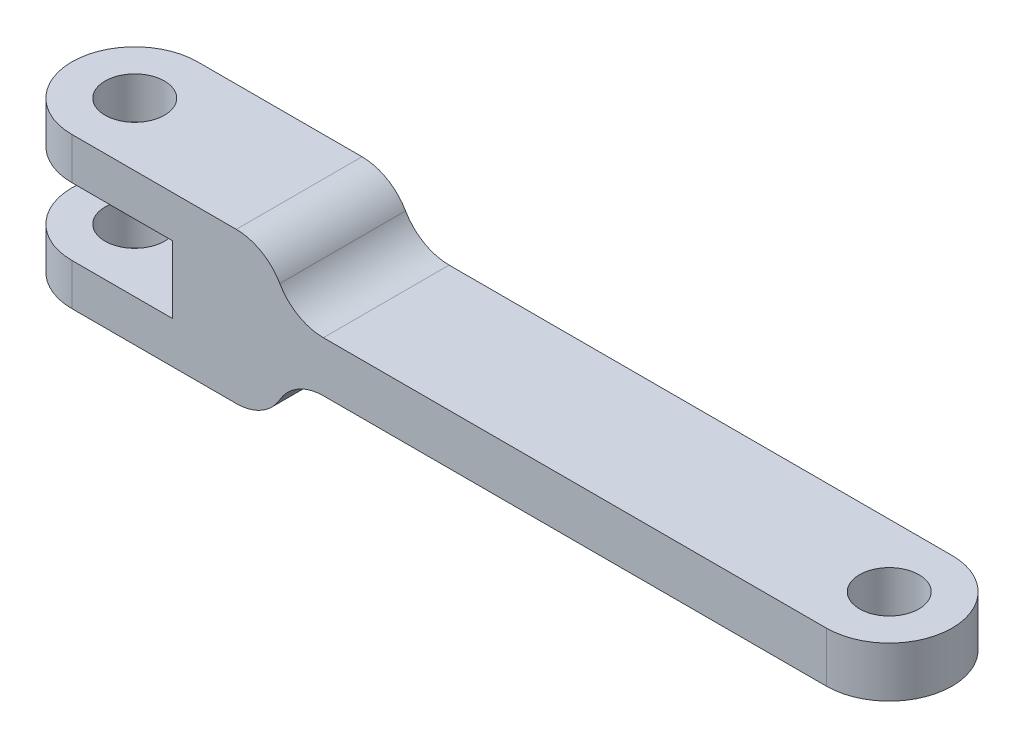
ISO-10303-21;
HEADER;
FILE_DESCRIPTION(('STEP AP214'),'2;1');
FILE_NAME('part.step','',(''),(''),'','','');
FILE_SCHEMA(('AUTOMOTIVE_DESIGN { 1 0 10303 214 1 1 1 1 }'));
ENDSEC;
DATA;
#1=APPLICATION_CONTEXT('core data for automotive mechanical design processes');
#2=APPLICATION_PROTOCOL_DEFINITION('international standard','automotive_design',2000,#1);
#3=PRODUCT_CONTEXT('',#1,'mechanical');
#4=PRODUCT('Part','Part','',(#3));
#5=PRODUCT_RELATED_PRODUCT_CATEGORY('part','',(#4));
#6=PRODUCT_DEFINITION_FORMATION('','',#4);
#7=PRODUCT_DEFINITION_CONTEXT('part definition',#1,'design');
#8=PRODUCT_DEFINITION('design','',#6,#7);
#9=PRODUCT_DEFINITION_SHAPE('','',#8);
#10=(LENGTH_UNIT() NAMED_UNIT(*) SI_UNIT(.MILLI.,.METRE.));
#11=(NAMED_UNIT(*) PLANE_ANGLE_UNIT() SI_UNIT($,.RADIAN.));
#12=(NAMED_UNIT(*) SI_UNIT($,.STERADIAN.) SOLID_ANGLE_UNIT());
#13=UNCERTAINTY_MEASURE_WITH_UNIT(LENGTH_MEASURE(1.E-05),#10,'distance_accuracy_value','');
#14=(GEOMETRIC_REPRESENTATION_CONTEXT(3) GLOBAL_UNCERTAINTY_ASSIGNED_CONTEXT((#13)) GLOBAL_UNIT_ASSIGNED_CONTEXT((#10,
#11,#12)) REPRESENTATION_CONTEXT('',''));
#15=CARTESIAN_POINT('',(0.,0.,0.));
#16=DIRECTION('',(0.,0.,1.));
#17=DIRECTION('',(1.,0.,0.));
#18=AXIS2_PLACEMENT_3D('',#15,#16,#17);
#19=CARTESIAN_POINT('',(38.1,7.62,0.));
#20=DIRECTION('',(0.,-1.,0.));
#21=DIRECTION('',(0.,0.,-1.));
#22=AXIS2_PLACEMENT_3D('',#19,#20,#21);
#23=CYLINDRICAL_SURFACE('',#22,3.17500000000001);
#24=DIRECTION('',(0.,-1.,0.));
#25=VECTOR('',#24,1.);
#26=CARTESIAN_POINT('',(38.1,7.62,3.175));
#27=LINE('',#26,#25);
#28=CARTESIAN_POINT('',(38.1,5.08,3.17500000000001));
#29=VERTEX_POINT('',#28);
#30=CARTESIAN_POINT('',(38.1,2.54,3.175));
#31=VERTEX_POINT('',#30);
#32=EDGE_CURVE('E181',#29,#31,#27,.T.);
#33=ORIENTED_EDGE('',*,*,#32,.T.);
#34=CARTESIAN_POINT('',(38.1,2.54,0.));
#35=DIRECTION('',(0.,-1.,0.));
#36=DIRECTION('',(0.,0.,-1.));
#37=AXIS2_PLACEMENT_3D('',#34,#35,#36);
#38=CIRCLE('',#37,3.17500000000001);
#39=CARTESIAN_POINT('',(38.1,2.54,-3.175));
#40=VERTEX_POINT('',#39);
#41=EDGE_CURVE('E168',#31,#40,#38,.F.);
#42=ORIENTED_EDGE('',*,*,#41,.T.);
#43=DIRECTION('',(0.,-1.,0.));
#44=VECTOR('',#43,1.);
#45=CARTESIAN_POINT('',(38.1,7.62,-3.175));
#46=LINE('',#45,#44);
#47=CARTESIAN_POINT('',(38.1,5.08,-3.175));
#48=VERTEX_POINT('',#47);
#49=EDGE_CURVE('E179',#48,#40,#46,.T.);
#50=ORIENTED_EDGE('',*,*,#49,.F.);
#51=CARTESIAN_POINT('',(38.1,5.08,0.));
#52=DIRECTION('',(0.,1.,0.));
#53=DIRECTION('',(0.,0.,1.));
#54=AXIS2_PLACEMENT_3D('',#51,#52,#53);
#55=CIRCLE('',#54,3.17500000000001);
#56=EDGE_CURVE('E206',#48,#29,#55,.F.);
#57=ORIENTED_EDGE('',*,*,#56,.T.);
#58=EDGE_LOOP('',(#33,#42,#50,#57));
#59=FACE_BOUND('',#58,.T.);
#60=ADVANCED_FACE('F60',(#59),#23,.T.);
#61=CARTESIAN_POINT('',(38.1,7.62,0.));
#62=DIRECTION('',(0.,-1.,0.));
#63=DIRECTION('',(0.,0.,-1.));
#64=AXIS2_PLACEMENT_3D('',#61,#62,#63);
#65=CYLINDRICAL_SURFACE('',#64,1.5);
#66=CARTESIAN_POINT('',(38.1,5.08,0.));
#67=DIRECTION('',(0.,1.,0.));
#68=DIRECTION('',(0.,0.,1.));
#69=AXIS2_PLACEMENT_3D('',#66,#67,#68);
#70=CIRCLE('',#69,1.5);
#71=CARTESIAN_POINT('',(38.1,5.08,-1.5));
#72=VERTEX_POINT('',#71);
#73=EDGE_CURVE('E202',#72,#72,#70,.F.);
#74=CARTESIAN_POINT('',(38.1,2.54,0.));
#75=DIRECTION('',(0.,-1.,0.));
#76=DIRECTION('',(0.,0.,-1.));
#77=AXIS2_PLACEMENT_3D('',#74,#75,#76);
#78=CIRCLE('',#77,1.5);
#79=CARTESIAN_POINT('',(38.1,2.54,-1.5));
#80=VERTEX_POINT('',#79);
#81=EDGE_CURVE('E183',#80,#80,#78,.F.);
#82=CARTESIAN_POINT('',(38.1,5.08,-1.5));
#83=CARTESIAN_POINT('',(38.1,5.05354166666667,-1.5));
#84=CARTESIAN_POINT('',(38.1,5.02708333333333,-1.5));
#85=CARTESIAN_POINT('',(38.1,4.97416666666667,-1.5));
#86=CARTESIAN_POINT('',(38.1,4.94770833333333,-1.5));
#87=CARTESIAN_POINT('',(38.1,4.89479166666667,-1.5));
#88=CARTESIAN_POINT('',(38.1,4.86833333333333,-1.5));
#89=CARTESIAN_POINT('',(38.1,4.81541666666667,-1.5));
#90=CARTESIAN_POINT('',(38.1,4.78895833333333,-1.5));
#91=CARTESIAN_POINT('',(38.1,4.73604166666667,-1.5));
#92=CARTESIAN_POINT('',(38.1,4.70958333333333,-1.5));
#93=CARTESIAN_POINT('',(38.1,4.65666666666667,-1.5));
#94=CARTESIAN_POINT('',(38.1,4.63020833333333,-1.5));
#95=CARTESIAN_POINT('',(38.1,4.57729166666667,-1.5));
#96=CARTESIAN_POINT('',(38.1,4.55083333333333,-1.5));
#97=CARTESIAN_POINT('',(38.1,4.49791666666667,-1.5));
#98=CARTESIAN_POINT('',(38.1,4.47145833333333,-1.5));
#99=CARTESIAN_POINT('',(38.1,4.41854166666667,-1.5));
#100=CARTESIAN_POINT('',(38.1,4.39208333333333,-1.5));
#101=CARTESIAN_POINT('',(38.1,4.33916666666667,-1.5));
#102=CARTESIAN_POINT('',(38.1,4.31270833333333,-1.5));
#103=CARTESIAN_POINT('',(38.1,4.25979166666667,-1.5));
#104=CARTESIAN_POINT('',(38.1,4.23333333333333,-1.5));
#105=CARTESIAN_POINT('',(38.1,4.18041666666667,-1.5));
#106=CARTESIAN_POINT('',(38.1,4.15395833333333,-1.5));
#107=CARTESIAN_POINT('',(38.1,4.10104166666667,-1.5));
#108=CARTESIAN_POINT('',(38.1,4.07458333333333,-1.5));
#109=CARTESIAN_POINT('',(38.1,4.02166666666667,-1.5));
#110=CARTESIAN_POINT('',(38.1,3.99520833333333,-1.5));
#111=CARTESIAN_POINT('',(38.1,3.94229166666667,-1.5));
#112=CARTESIAN_POINT('',(38.1,3.91583333333333,-1.5));
#113=CARTESIAN_POINT('',(38.1,3.86291666666667,-1.5));
#114=CARTESIAN_POINT('',(38.1,3.83645833333333,-1.5));
#115=CARTESIAN_POINT('',(38.1,3.78354166666667,-1.5));
#116=CARTESIAN_POINT('',(38.1,3.75708333333333,-1.5));
#117=CARTESIAN_POINT('',(38.1,3.70416666666667,-1.5));
#118=CARTESIAN_POINT('',(38.1,3.67770833333333,-1.5));
#119=CARTESIAN_POINT('',(38.1,3.62479166666667,-1.5));
#120=CARTESIAN_POINT('',(38.1,3.59833333333333,-1.5));
#121=CARTESIAN_POINT('',(38.1,3.54541666666667,-1.5));
#122=CARTESIAN_POINT('',(38.1,3.51895833333333,-1.5));
#123=CARTESIAN_POINT('',(38.1,3.46604166666667,-1.5));
#124=CARTESIAN_POINT('',(38.1,3.43958333333333,-1.5));
#125=CARTESIAN_POINT('',(38.1,3.38666666666667,-1.5));
#126=CARTESIAN_POINT('',(38.1,3.36020833333333,-1.5));
#127=CARTESIAN_POINT('',(38.1,3.30729166666667,-1.5));
#128=CARTESIAN_POINT('',(38.1,3.28083333333334,-1.5));
#129=CARTESIAN_POINT('',(38.1,3.22791666666667,-1.5));
#130=CARTESIAN_POINT('',(38.1,3.20145833333334,-1.5));
#131=CARTESIAN_POINT('',(38.1,3.14854166666667,-1.5));
#132=CARTESIAN_POINT('',(38.1,3.12208333333333,-1.5));
#133=CARTESIAN_POINT('',(38.1,3.06916666666667,-1.5));
#134=CARTESIAN_POINT('',(38.1,3.04270833333333,-1.5));
#135=CARTESIAN_POINT('',(38.1,2.98979166666667,-1.5));
#136=CARTESIAN_POINT('',(38.1,2.96333333333334,-1.5));
#137=CARTESIAN_POINT('',(38.1,2.91041666666667,-1.5));
#138=CARTESIAN_POINT('',(38.1,2.88395833333334,-1.5));
#139=CARTESIAN_POINT('',(38.1,2.83104166666667,-1.5));
#140=CARTESIAN_POINT('',(38.1,2.80458333333334,-1.5));
#141=CARTESIAN_POINT('',(38.1,2.75166666666667,-1.5));
#142=CARTESIAN_POINT('',(38.1,2.72520833333334,-1.5));
#143=CARTESIAN_POINT('',(38.1,2.67229166666667,-1.5));
#144=CARTESIAN_POINT('',(38.1,2.64583333333334,-1.5));
#145=CARTESIAN_POINT('',(38.1,2.59291666666667,-1.5));
#146=CARTESIAN_POINT('',(38.1,2.56645833333334,-1.5));
#147=CARTESIAN_POINT('',(38.1,2.54,-1.5));
#148=B_SPLINE_CURVE_WITH_KNOTS('',3,(#82,#83,#84,#85,#86,#87,#88,#89,#90,#91,#92,#93,#94,#95,
#96,#97,#98,#99,#100,#101,#102,#103,#104,#105,#106,#107,#108,#109,#110,#111,#112,#113,#114,#115,
#116,#117,#118,#119,#120,#121,#122,#123,#124,#125,#126,#127,#128,#129,#130,#131,#132,#133,#134,
#135,#136,#137,#138,#139,#140,#141,#142,#143,#144,#145,#146,#147),.UNSPECIFIED.,.F.,.F.,(4,2,2,
2,2,2,2,2,2,2,2,2,2,2,2,2,2,2,2,2,2,2,2,2,2,2,2,2,2,2,2,2,4),(0.,0.0793750000000004,
0.158750000000001,0.238125,0.3175,0.396875,0.476249999999999,0.555625,0.635,0.714375,
0.793749999999999,0.873124999999999,0.952499999999999,1.031875,1.11125,1.190625,1.27,1.349375,
1.42875,1.508125,1.5875,1.666875,1.74625,1.825625,1.905,1.984375,2.06375,2.143125,2.2225,
2.301875,2.38125,2.460625,2.54),.UNSPECIFIED.);
#149=EDGE_CURVE('BSEAM361',#72,#80,#148,.T.);
#150=ORIENTED_EDGE('',*,*,#73,.F.);
#151=ORIENTED_EDGE('',*,*,#81,.F.);
#152=ORIENTED_EDGE('',*,*,#149,.T.);
#153=ORIENTED_EDGE('',*,*,#149,.F.);
#154=EDGE_LOOP('',(#150,#152,#151,#153));
#155=FACE_BOUND('',#154,.T.);
#156=ADVANCED_FACE('F361',(#155),#65,.F.);
#157=CARTESIAN_POINT('',(0.,7.62,3.175));
#158=DIRECTION('',(0.,0.,1.));
#159=DIRECTION('',(1.,0.,0.));
#160=AXIS2_PLACEMENT_3D('',#157,#158,#159);
#161=PLANE('',#160);
#162=CARTESIAN_POINT('',(12.7,7.62,3.175));
#163=DIRECTION('',(0.,0.,1.));
#164=DIRECTION('',(1.,0.,0.));
#165=AXIS2_PLACEMENT_3D('',#162,#163,#164);
#166=CIRCLE('',#165,2.54);
#167=CARTESIAN_POINT('',(12.7,5.08,3.175));
#168=VERTEX_POINT('',#167);
#169=CARTESIAN_POINT('',(10.5002954743875,6.35,3.175));
#170=VERTEX_POINT('',#169);
#171=EDGE_CURVE('E212',#168,#170,#166,.F.);
#172=ORIENTED_EDGE('',*,*,#171,.T.);
#173=CARTESIAN_POINT('',(8.30059094877505,5.08,3.175));
#174=DIRECTION('',(0.,0.,1.));
#175=DIRECTION('',(1.,0.,0.));
#176=AXIS2_PLACEMENT_3D('',#173,#174,#175);
#177=CIRCLE('',#176,2.54);
#178=CARTESIAN_POINT('',(8.30059094877505,7.62,3.175));
#179=VERTEX_POINT('',#178);
#180=EDGE_CURVE('E232',#170,#179,#177,.T.);
#181=ORIENTED_EDGE('',*,*,#180,.T.);
#182=DIRECTION('',(-1.,0.,0.));
#183=VECTOR('',#182,1.);
#184=CARTESIAN_POINT('',(0.,7.62,3.175));
#185=LINE('',#184,#183);
#186=CARTESIAN_POINT('',(0.,7.62,3.175));
#187=VERTEX_POINT('',#186);
#188=EDGE_CURVE('E278',#179,#187,#185,.T.);
#189=ORIENTED_EDGE('',*,*,#188,.T.);
#190=DIRECTION('',(0.,-1.,0.));
#191=VECTOR('',#190,1.);
#192=CARTESIAN_POINT('',(0.,7.62,3.175));
#193=LINE('',#192,#191);
#194=CARTESIAN_POINT('',(0.,5.51,3.175));
#195=VERTEX_POINT('',#194);
#196=EDGE_CURVE('E279',#187,#195,#193,.T.);
#197=ORIENTED_EDGE('',*,*,#196,.T.);
#198=DIRECTION('',(1.,0.,0.));
#199=VECTOR('',#198,1.);
#200=CARTESIAN_POINT('',(5.08,5.51,3.175));
#201=LINE('',#200,#199);
#202=CARTESIAN_POINT('',(5.08,5.51,3.175));
#203=VERTEX_POINT('',#202);
#204=EDGE_CURVE('E312',#195,#203,#201,.T.);
#205=ORIENTED_EDGE('',*,*,#204,.T.);
#206=DIRECTION('',(0.,-1.,0.));
#207=VECTOR('',#206,1.);
#208=CARTESIAN_POINT('',(5.08,5.51,3.175));
#209=LINE('',#208,#207);
#210=CARTESIAN_POINT('',(5.08,2.11,3.175));
#211=VERTEX_POINT('',#210);
#212=EDGE_CURVE('E260',#203,#211,#209,.T.);
#213=ORIENTED_EDGE('',*,*,#212,.T.);
#214=DIRECTION('',(1.,0.,0.));
#215=VECTOR('',#214,1.);
#216=CARTESIAN_POINT('',(5.08,2.11,3.175));
#217=LINE('',#216,#215);
#218=CARTESIAN_POINT('',(0.,2.11,3.175));
#219=VERTEX_POINT('',#218);
#220=EDGE_CURVE('E330',#219,#211,#217,.T.);
#221=ORIENTED_EDGE('',*,*,#220,.F.);
#222=CARTESIAN_POINT('',(0.,0.,3.175));
#223=VERTEX_POINT('',#222);
#224=EDGE_CURVE('E257',#219,#223,#193,.T.);
#225=ORIENTED_EDGE('',*,*,#224,.T.);
#226=DIRECTION('',(-1.,0.,0.));
#227=VECTOR('',#226,1.);
#228=CARTESIAN_POINT('',(0.,0.,3.175));
#229=LINE('',#228,#227);
#230=CARTESIAN_POINT('',(8.30059094877505,0.,3.175));
#231=VERTEX_POINT('',#230);
#232=EDGE_CURVE('E249',#231,#223,#229,.T.);
#233=ORIENTED_EDGE('',*,*,#232,.F.);
#234=CARTESIAN_POINT('',(8.30059094877505,2.54,3.175));
#235=DIRECTION('',(0.,0.,1.));
#236=DIRECTION('',(1.,0.,0.));
#237=AXIS2_PLACEMENT_3D('',#234,#235,#236);
#238=CIRCLE('',#237,2.54);
#239=CARTESIAN_POINT('',(10.5002954743875,1.27,3.175));
#240=VERTEX_POINT('',#239);
#241=EDGE_CURVE('E229',#231,#240,#238,.T.);
#242=ORIENTED_EDGE('',*,*,#241,.T.);
#243=CARTESIAN_POINT('',(12.7,0.,3.175));
#244=DIRECTION('',(0.,0.,1.));
#245=DIRECTION('',(1.,0.,0.));
#246=AXIS2_PLACEMENT_3D('',#243,#244,#245);
#247=CIRCLE('',#246,2.54);
#248=CARTESIAN_POINT('',(12.7,2.54,3.175));
#249=VERTEX_POINT('',#248);
#250=EDGE_CURVE('E219',#240,#249,#247,.F.);
#251=ORIENTED_EDGE('',*,*,#250,.T.);
#252=DIRECTION('',(1.,0.,0.));
#253=VECTOR('',#252,1.);
#254=CARTESIAN_POINT('',(0.,2.54,3.175));
#255=LINE('',#254,#253);
#256=EDGE_CURVE('E174',#249,#31,#255,.T.);
#257=ORIENTED_EDGE('',*,*,#256,.T.);
#258=ORIENTED_EDGE('',*,*,#32,.F.);
#259=DIRECTION('',(-1.,0.,0.));
#260=VECTOR('',#259,1.);
#261=CARTESIAN_POINT('',(0.,5.08,3.175));
#262=LINE('',#261,#260);
#263=EDGE_CURVE('E341',#29,#168,#262,.T.);
#264=ORIENTED_EDGE('',*,*,#263,.T.);
#265=EDGE_LOOP('',(#172,#181,#189,#197,#205,#213,#221,#225,#233,#242,#251,#257,#258,#264));
#266=FACE_BOUND('',#265,.T.);
#267=ADVANCED_FACE('F254',(#266),#161,.T.);
#268=CARTESIAN_POINT('',(0.,7.62,-3.175));
#269=DIRECTION('',(0.,0.,-1.));
#270=DIRECTION('',(-1.,0.,0.));
#271=AXIS2_PLACEMENT_3D('',#268,#269,#270);
#272=PLANE('',#271);
#273=DIRECTION('',(1.,0.,0.));
#274=VECTOR('',#273,1.);
#275=CARTESIAN_POINT('',(0.,7.62,-3.175));
#276=LINE('',#275,#274);
#277=CARTESIAN_POINT('',(0.,7.62,-3.175));
#278=VERTEX_POINT('',#277);
#279=CARTESIAN_POINT('',(8.30059094877505,7.62,-3.175));
#280=VERTEX_POINT('',#279);
#281=EDGE_CURVE('E293',#278,#280,#276,.T.);
#282=ORIENTED_EDGE('',*,*,#281,.T.);
#283=CARTESIAN_POINT('',(8.30059094877505,5.08,-3.175));
#284=DIRECTION('',(0.,0.,-1.));
#285=DIRECTION('',(-1.,0.,0.));
#286=AXIS2_PLACEMENT_3D('',#283,#284,#285);
#287=CIRCLE('',#286,2.54);
#288=CARTESIAN_POINT('',(10.5002954743875,6.35,-3.175));
#289=VERTEX_POINT('',#288);
#290=EDGE_CURVE('E240',#280,#289,#287,.T.);
#291=ORIENTED_EDGE('',*,*,#290,.T.);
#292=CARTESIAN_POINT('',(12.7,7.62,-3.175));
#293=DIRECTION('',(0.,0.,-1.));
#294=DIRECTION('',(-1.,0.,0.));
#295=AXIS2_PLACEMENT_3D('',#292,#293,#294);
#296=CIRCLE('',#295,2.54);
#297=CARTESIAN_POINT('',(12.7,5.08,-3.175));
#298=VERTEX_POINT('',#297);
#299=EDGE_CURVE('E216',#289,#298,#296,.F.);
#300=ORIENTED_EDGE('',*,*,#299,.T.);
#301=DIRECTION('',(-1.,0.,0.));
#302=VECTOR('',#301,1.);
#303=CARTESIAN_POINT('',(10.16,5.08,-3.175));
#304=LINE('',#303,#302);
#305=EDGE_CURVE('E189',#48,#298,#304,.T.);
#306=ORIENTED_EDGE('',*,*,#305,.F.);
#307=ORIENTED_EDGE('',*,*,#49,.T.);
#308=DIRECTION('',(-1.,0.,0.));
#309=VECTOR('',#308,1.);
#310=CARTESIAN_POINT('',(10.16,2.54,-3.175));
#311=LINE('',#310,#309);
#312=CARTESIAN_POINT('',(12.7,2.54,-3.175));
#313=VERTEX_POINT('',#312);
#314=EDGE_CURVE('E163',#40,#313,#311,.T.);
#315=ORIENTED_EDGE('',*,*,#314,.T.);
#316=CARTESIAN_POINT('',(12.7,0.,-3.175));
#317=DIRECTION('',(0.,0.,-1.));
#318=DIRECTION('',(-1.,0.,0.));
#319=AXIS2_PLACEMENT_3D('',#316,#317,#318);
#320=CIRCLE('',#319,2.54);
#321=CARTESIAN_POINT('',(10.5002954743875,1.27,-3.175));
#322=VERTEX_POINT('',#321);
#323=EDGE_CURVE('E222',#313,#322,#320,.F.);
#324=ORIENTED_EDGE('',*,*,#323,.T.);
#325=CARTESIAN_POINT('',(8.30059094877505,2.54,-3.175));
#326=DIRECTION('',(0.,0.,-1.));
#327=DIRECTION('',(-1.,0.,0.));
#328=AXIS2_PLACEMENT_3D('',#325,#326,#327);
#329=CIRCLE('',#328,2.54);
#330=CARTESIAN_POINT('',(8.30059094877505,0.,-3.175));
#331=VERTEX_POINT('',#330);
#332=EDGE_CURVE('E76',#322,#331,#329,.T.);
#333=ORIENTED_EDGE('',*,*,#332,.T.);
#334=DIRECTION('',(1.,0.,0.));
#335=VECTOR('',#334,1.);
#336=CARTESIAN_POINT('',(0.,0.,-3.175));
#337=LINE('',#336,#335);
#338=CARTESIAN_POINT('',(0.,0.,-3.175));
#339=VERTEX_POINT('',#338);
#340=EDGE_CURVE('E251',#339,#331,#337,.T.);
#341=ORIENTED_EDGE('',*,*,#340,.F.);
#342=DIRECTION('',(0.,-1.,0.));
#343=VECTOR('',#342,1.);
#344=CARTESIAN_POINT('',(0.,7.62,-3.175));
#345=LINE('',#344,#343);
#346=CARTESIAN_POINT('',(0.,2.11,-3.175));
#347=VERTEX_POINT('',#346);
#348=EDGE_CURVE('E198',#347,#339,#345,.T.);
#349=ORIENTED_EDGE('',*,*,#348,.F.);
#350=DIRECTION('',(-1.,0.,0.));
#351=VECTOR('',#350,1.);
#352=CARTESIAN_POINT('',(0.,2.11,-3.175));
#353=LINE('',#352,#351);
#354=CARTESIAN_POINT('',(5.08,2.11,-3.175));
#355=VERTEX_POINT('',#354);
#356=EDGE_CURVE('E323',#355,#347,#353,.T.);
#357=ORIENTED_EDGE('',*,*,#356,.F.);
#358=DIRECTION('',(0.,-1.,0.));
#359=VECTOR('',#358,1.);
#360=CARTESIAN_POINT('',(5.08,5.51,-3.175));
#361=LINE('',#360,#359);
#362=CARTESIAN_POINT('',(5.08,5.51,-3.175));
#363=VERTEX_POINT('',#362);
#364=EDGE_CURVE('E267',#363,#355,#361,.T.);
#365=ORIENTED_EDGE('',*,*,#364,.F.);
#366=DIRECTION('',(-1.,0.,0.));
#367=VECTOR('',#366,1.);
#368=CARTESIAN_POINT('',(0.,5.51,-3.175));
#369=LINE('',#368,#367);
#370=CARTESIAN_POINT('',(0.,5.51,-3.175));
#371=VERTEX_POINT('',#370);
#372=EDGE_CURVE('E305',#363,#371,#369,.T.);
#373=ORIENTED_EDGE('',*,*,#372,.T.);
#374=EDGE_CURVE('E191',#278,#371,#345,.T.);
#375=ORIENTED_EDGE('',*,*,#374,.F.);
#376=EDGE_LOOP('',(#282,#291,#300,#306,#307,#315,#324,#333,#341,#349,#357,#365,#373,#375));
#377=FACE_BOUND('',#376,.T.);
#378=ADVANCED_FACE('F187',(#377),#272,.T.);
#379=CARTESIAN_POINT('',(0.,0.,0.));
#380=DIRECTION('',(0.,1.,0.));
#381=DIRECTION('',(0.,0.,1.));
#382=AXIS2_PLACEMENT_3D('',#379,#380,#381);
#383=PLANE('',#382);
#384=CARTESIAN_POINT('',(0.,0.,0.));
#385=DIRECTION('',(0.,1.,0.));
#386=DIRECTION('',(0.,0.,1.));
#387=AXIS2_PLACEMENT_3D('',#384,#385,#386);
#388=CIRCLE('',#387,1.5);
#389=CARTESIAN_POINT('',(0.,0.,-1.5));
#390=VERTEX_POINT('',#389);
#391=EDGE_CURVE('E275',#390,#390,#388,.T.);
#392=ORIENTED_EDGE('',*,*,#391,.T.);
#393=EDGE_LOOP('',(#392));
#394=FACE_BOUND('',#393,.T.);
#395=ORIENTED_EDGE('',*,*,#340,.T.);
#396=DIRECTION('',(0.,0.,-1.));
#397=VECTOR('',#396,1.);
#398=CARTESIAN_POINT('',(8.30059094877505,0.,0.));
#399=LINE('',#398,#397);
#400=EDGE_CURVE('E69',#331,#231,#399,.F.);
#401=ORIENTED_EDGE('',*,*,#400,.T.);
#402=ORIENTED_EDGE('',*,*,#232,.T.);
#403=CARTESIAN_POINT('',(0.,0.,0.));
#404=DIRECTION('',(0.,1.,0.));
#405=DIRECTION('',(0.,0.,1.));
#406=AXIS2_PLACEMENT_3D('',#403,#404,#405);
#407=CIRCLE('',#406,3.175);
#408=EDGE_CURVE('E264',#339,#223,#407,.T.);
#409=ORIENTED_EDGE('',*,*,#408,.F.);
#410=EDGE_LOOP('',(#395,#401,#402,#409));
#411=FACE_BOUND('',#410,.T.);
#412=ADVANCED_FACE('F247',(#394,#411),#383,.F.);
#413=CARTESIAN_POINT('',(0.,7.62,0.));
#414=DIRECTION('',(0.,-1.,0.));
#415=DIRECTION('',(0.,0.,-1.));
#416=AXIS2_PLACEMENT_3D('',#413,#414,#415);
#417=CYLINDRICAL_SURFACE('',#416,3.175);
#418=CARTESIAN_POINT('',(0.,2.11,0.));
#419=DIRECTION('',(0.,1.,0.));
#420=DIRECTION('',(0.,0.,1.));
#421=AXIS2_PLACEMENT_3D('',#418,#419,#420);
#422=CIRCLE('',#421,3.175);
#423=EDGE_CURVE('E334',#347,#219,#422,.T.);
#424=ORIENTED_EDGE('',*,*,#423,.F.);
#425=ORIENTED_EDGE('',*,*,#348,.T.);
#426=ORIENTED_EDGE('',*,*,#408,.T.);
#427=ORIENTED_EDGE('',*,*,#224,.F.);
#428=EDGE_LOOP('',(#424,#425,#426,#427));
#429=FACE_BOUND('',#428,.T.);
#430=ADVANCED_FACE('F437',(#429),#417,.T.);
#431=CARTESIAN_POINT('',(0.,7.62,0.));
#432=DIRECTION('',(0.,-1.,0.));
#433=DIRECTION('',(0.,0.,-1.));
#434=AXIS2_PLACEMENT_3D('',#431,#432,#433);
#435=CYLINDRICAL_SURFACE('',#434,1.5);
#436=CARTESIAN_POINT('',(0.,2.11,0.));
#437=DIRECTION('',(0.,1.,0.));
#438=DIRECTION('',(0.,0.,1.));
#439=AXIS2_PLACEMENT_3D('',#436,#437,#438);
#440=CIRCLE('',#439,1.5);
#441=CARTESIAN_POINT('',(0.,2.11,-1.5));
#442=VERTEX_POINT('',#441);
#443=EDGE_CURVE('E337',#442,#442,#440,.T.);
#444=CARTESIAN_POINT('',(0.,0.,-1.5));
#445=CARTESIAN_POINT('',(0.,0.0219791666666667,-1.5));
#446=CARTESIAN_POINT('',(0.,0.0439583333333333,-1.5));
#447=CARTESIAN_POINT('',(0.,0.0879166666666667,-1.5));
#448=CARTESIAN_POINT('',(0.,0.109895833333333,-1.5));
#449=CARTESIAN_POINT('',(0.,0.153854166666667,-1.5));
#450=CARTESIAN_POINT('',(0.,0.175833333333333,-1.5));
#451=CARTESIAN_POINT('',(0.,0.219791666666667,-1.5));
#452=CARTESIAN_POINT('',(0.,0.241770833333333,-1.5));
#453=CARTESIAN_POINT('',(0.,0.285729166666667,-1.5));
#454=CARTESIAN_POINT('',(0.,0.307708333333333,-1.5));
#455=CARTESIAN_POINT('',(0.,0.351666666666667,-1.5));
#456=CARTESIAN_POINT('',(0.,0.373645833333333,-1.5));
#457=CARTESIAN_POINT('',(0.,0.417604166666667,-1.5));
#458=CARTESIAN_POINT('',(0.,0.439583333333333,-1.5));
#459=CARTESIAN_POINT('',(0.,0.483541666666667,-1.5));
#460=CARTESIAN_POINT('',(0.,0.505520833333334,-1.5));
#461=CARTESIAN_POINT('',(0.,0.549479166666667,-1.5));
#462=CARTESIAN_POINT('',(0.,0.571458333333334,-1.5));
#463=CARTESIAN_POINT('',(0.,0.615416666666667,-1.5));
#464=CARTESIAN_POINT('',(0.,0.637395833333334,-1.5));
#465=CARTESIAN_POINT('',(0.,0.681354166666667,-1.5));
#466=CARTESIAN_POINT('',(0.,0.703333333333334,-1.5));
#467=CARTESIAN_POINT('',(0.,0.747291666666667,-1.5));
#468=CARTESIAN_POINT('',(0.,0.769270833333334,-1.5));
#469=CARTESIAN_POINT('',(0.,0.813229166666667,-1.5));
#470=CARTESIAN_POINT('',(0.,0.835208333333334,-1.5));
#471=CARTESIAN_POINT('',(0.,0.879166666666667,-1.5));
#472=CARTESIAN_POINT('',(0.,0.901145833333334,-1.5));
#473=CARTESIAN_POINT('',(0.,0.945104166666667,-1.5));
#474=CARTESIAN_POINT('',(0.,0.967083333333334,-1.5));
#475=CARTESIAN_POINT('',(0.,1.01104166666667,-1.5));
#476=CARTESIAN_POINT('',(0.,1.03302083333333,-1.5));
#477=CARTESIAN_POINT('',(0.,1.07697916666667,-1.5));
#478=CARTESIAN_POINT('',(0.,1.09895833333333,-1.5));
#479=CARTESIAN_POINT('',(0.,1.14291666666667,-1.5));
#480=CARTESIAN_POINT('',(0.,1.16489583333333,-1.5));
#481=CARTESIAN_POINT('',(0.,1.20885416666667,-1.5));
#482=CARTESIAN_POINT('',(0.,1.23083333333333,-1.5));
#483=CARTESIAN_POINT('',(0.,1.27479166666667,-1.5));
#484=CARTESIAN_POINT('',(0.,1.29677083333333,-1.5));
#485=CARTESIAN_POINT('',(0.,1.34072916666667,-1.5));
#486=CARTESIAN_POINT('',(0.,1.36270833333333,-1.5));
#487=CARTESIAN_POINT('',(0.,1.40666666666667,-1.5));
#488=CARTESIAN_POINT('',(0.,1.42864583333333,-1.5));
#489=CARTESIAN_POINT('',(0.,1.47260416666667,-1.5));
#490=CARTESIAN_POINT('',(0.,1.49458333333333,-1.5));
#491=CARTESIAN_POINT('',(0.,1.53854166666667,-1.5));
#492=CARTESIAN_POINT('',(0.,1.56052083333333,-1.5));
#493=CARTESIAN_POINT('',(0.,1.60447916666667,-1.5));
#494=CARTESIAN_POINT('',(0.,1.62645833333333,-1.5));
#495=CARTESIAN_POINT('',(0.,1.67041666666667,-1.5));
#496=CARTESIAN_POINT('',(0.,1.69239583333333,-1.5));
#497=CARTESIAN_POINT('',(0.,1.73635416666667,-1.5));
#498=CARTESIAN_POINT('',(0.,1.75833333333333,-1.5));
#499=CARTESIAN_POINT('',(0.,1.80229166666667,-1.5));
#500=CARTESIAN_POINT('',(0.,1.82427083333333,-1.5));
#501=CARTESIAN_POINT('',(0.,1.86822916666667,-1.5));
#502=CARTESIAN_POINT('',(0.,1.89020833333333,-1.5));
#503=CARTESIAN_POINT('',(0.,1.93416666666667,-1.5));
#504=CARTESIAN_POINT('',(0.,1.95614583333333,-1.5));
#505=CARTESIAN_POINT('',(0.,2.00010416666667,-1.5));
#506=CARTESIAN_POINT('',(0.,2.02208333333333,-1.5));
#507=CARTESIAN_POINT('',(0.,2.06604166666667,-1.5));
#508=CARTESIAN_POINT('',(0.,2.08802083333333,-1.5));
#509=CARTESIAN_POINT('',(0.,2.11,-1.5));
#510=B_SPLINE_CURVE_WITH_KNOTS('',3,(#444,#445,#446,#447,#448,#449,#450,#451,#452,#453,#454,
#455,#456,#457,#458,#459,#460,#461,#462,#463,#464,#465,#466,#467,#468,#469,#470,#471,#472,#473,
#474,#475,#476,#477,#478,#479,#480,#481,#482,#483,#484,#485,#486,#487,#488,#489,#490,#491,#492,
#493,#494,#495,#496,#497,#498,#499,#500,#501,#502,#503,#504,#505,#506,#507,#508,#509),
.UNSPECIFIED.,.F.,.F.,(4,2,2,2,2,2,2,2,2,2,2,2,2,2,2,2,2,2,2,2,2,2,2,2,2,2,2,2,2,2,2,2,4),(0.,
0.0659375,0.131875,0.1978125,0.26375,0.3296875,0.395625,0.4615625,0.5275,0.5934375,0.659375,
0.7253125,0.79125,0.8571875,0.923125,0.9890625,1.055,1.1209375,1.186875,1.2528125,1.31875,
1.3846875,1.450625,1.5165625,1.5825,1.6484375,1.714375,1.7803125,1.84625,1.9121875,1.978125,
2.0440625,2.11),.UNSPECIFIED.);
#511=EDGE_CURVE('BSEAM484',#390,#442,#510,.T.);
#512=ORIENTED_EDGE('',*,*,#391,.F.);
#513=ORIENTED_EDGE('',*,*,#443,.T.);
#514=ORIENTED_EDGE('',*,*,#511,.T.);
#515=ORIENTED_EDGE('',*,*,#511,.F.);
#516=EDGE_LOOP('',(#512,#514,#513,#515));
#517=FACE_BOUND('',#516,.T.);
#518=ADVANCED_FACE('F484',(#517),#435,.F.);
#519=ORIENTED_EDGE('',*,*,#374,.T.);
#520=CARTESIAN_POINT('',(0.,5.51,0.));
#521=DIRECTION('',(0.,1.,0.));
#522=DIRECTION('',(0.,0.,1.));
#523=AXIS2_PLACEMENT_3D('',#520,#521,#522);
#524=CIRCLE('',#523,3.175);
#525=EDGE_CURVE('E315',#371,#195,#524,.T.);
#526=ORIENTED_EDGE('',*,*,#525,.T.);
#527=ORIENTED_EDGE('',*,*,#196,.F.);
#528=CARTESIAN_POINT('',(0.,7.62,0.));
#529=DIRECTION('',(0.,1.,0.));
#530=DIRECTION('',(0.,0.,1.));
#531=AXIS2_PLACEMENT_3D('',#528,#529,#530);
#532=CIRCLE('',#531,3.175);
#533=EDGE_CURVE('E288',#278,#187,#532,.T.);
#534=ORIENTED_EDGE('',*,*,#533,.F.);
#535=EDGE_LOOP('',(#519,#526,#527,#534));
#536=FACE_BOUND('',#535,.T.);
#537=ADVANCED_FACE('F486',(#536),#417,.T.);
#538=CARTESIAN_POINT('',(0.,5.51,0.));
#539=DIRECTION('',(0.,1.,0.));
#540=DIRECTION('',(0.,0.,1.));
#541=AXIS2_PLACEMENT_3D('',#538,#539,#540);
#542=CIRCLE('',#541,1.5);
#543=CARTESIAN_POINT('',(0.,5.51,-1.5));
#544=VERTEX_POINT('',#543);
#545=EDGE_CURVE('E319',#544,#544,#542,.T.);
#546=CARTESIAN_POINT('',(0.,7.62,0.));
#547=DIRECTION('',(0.,1.,0.));
#548=DIRECTION('',(0.,0.,1.));
#549=AXIS2_PLACEMENT_3D('',#546,#547,#548);
#550=CIRCLE('',#549,1.5);
#551=CARTESIAN_POINT('',(0.,7.62,-1.5));
#552=VERTEX_POINT('',#551);
#553=EDGE_CURVE('E270',#552,#552,#550,.T.);
#554=CARTESIAN_POINT('',(0.,5.51,-1.5));
#555=CARTESIAN_POINT('',(0.,5.53197916666667,-1.5));
#556=CARTESIAN_POINT('',(0.,5.55395833333333,-1.5));
#557=CARTESIAN_POINT('',(0.,5.59791666666667,-1.5));
#558=CARTESIAN_POINT('',(0.,5.61989583333333,-1.5));
#559=CARTESIAN_POINT('',(0.,5.66385416666667,-1.5));
#560=CARTESIAN_POINT('',(0.,5.68583333333333,-1.5));
#561=CARTESIAN_POINT('',(0.,5.72979166666667,-1.5));
#562=CARTESIAN_POINT('',(0.,5.75177083333333,-1.5));
#563=CARTESIAN_POINT('',(0.,5.79572916666667,-1.5));
#564=CARTESIAN_POINT('',(0.,5.81770833333333,-1.5));
#565=CARTESIAN_POINT('',(0.,5.86166666666667,-1.5));
#566=CARTESIAN_POINT('',(0.,5.88364583333333,-1.5));
#567=CARTESIAN_POINT('',(0.,5.92760416666667,-1.5));
#568=CARTESIAN_POINT('',(0.,5.94958333333333,-1.5));
#569=CARTESIAN_POINT('',(0.,5.99354166666667,-1.5));
#570=CARTESIAN_POINT('',(0.,6.01552083333333,-1.5));
#571=CARTESIAN_POINT('',(0.,6.05947916666667,-1.5));
#572=CARTESIAN_POINT('',(0.,6.08145833333333,-1.5));
#573=CARTESIAN_POINT('',(0.,6.12541666666667,-1.5));
#574=CARTESIAN_POINT('',(0.,6.14739583333333,-1.5));
#575=CARTESIAN_POINT('',(0.,6.19135416666667,-1.5));
#576=CARTESIAN_POINT('',(0.,6.21333333333333,-1.5));
#577=CARTESIAN_POINT('',(0.,6.25729166666667,-1.5));
#578=CARTESIAN_POINT('',(0.,6.27927083333333,-1.5));
#579=CARTESIAN_POINT('',(0.,6.32322916666667,-1.5));
#580=CARTESIAN_POINT('',(0.,6.34520833333333,-1.5));
#581=CARTESIAN_POINT('',(0.,6.38916666666667,-1.5));
#582=CARTESIAN_POINT('',(0.,6.41114583333333,-1.5));
#583=CARTESIAN_POINT('',(0.,6.45510416666667,-1.5));
#584=CARTESIAN_POINT('',(0.,6.47708333333333,-1.5));
#585=CARTESIAN_POINT('',(0.,6.52104166666667,-1.5));
#586=CARTESIAN_POINT('',(0.,6.54302083333333,-1.5));
#587=CARTESIAN_POINT('',(0.,6.58697916666667,-1.5));
#588=CARTESIAN_POINT('',(0.,6.60895833333333,-1.5));
#589=CARTESIAN_POINT('',(0.,6.65291666666667,-1.5));
#590=CARTESIAN_POINT('',(0.,6.67489583333333,-1.5));
#591=CARTESIAN_POINT('',(0.,6.71885416666667,-1.5));
#592=CARTESIAN_POINT('',(0.,6.74083333333333,-1.5));
#593=CARTESIAN_POINT('',(0.,6.78479166666667,-1.5));
#594=CARTESIAN_POINT('',(0.,6.80677083333333,-1.5));
#595=CARTESIAN_POINT('',(0.,6.85072916666667,-1.5));
#596=CARTESIAN_POINT('',(0.,6.87270833333333,-1.5));
#597=CARTESIAN_POINT('',(0.,6.91666666666667,-1.5));
#598=CARTESIAN_POINT('',(0.,6.93864583333333,-1.5));
#599=CARTESIAN_POINT('',(0.,6.98260416666667,-1.5));
#600=CARTESIAN_POINT('',(0.,7.00458333333333,-1.5));
#601=CARTESIAN_POINT('',(0.,7.04854166666667,-1.5));
#602=CARTESIAN_POINT('',(0.,7.07052083333333,-1.5));
#603=CARTESIAN_POINT('',(0.,7.11447916666667,-1.5));
#604=CARTESIAN_POINT('',(0.,7.13645833333333,-1.5));
#605=CARTESIAN_POINT('',(0.,7.18041666666667,-1.5));
#606=CARTESIAN_POINT('',(0.,7.20239583333333,-1.5));
#607=CARTESIAN_POINT('',(0.,7.24635416666667,-1.5));
#608=CARTESIAN_POINT('',(0.,7.26833333333333,-1.5));
#609=CARTESIAN_POINT('',(0.,7.31229166666667,-1.5));
#610=CARTESIAN_POINT('',(0.,7.33427083333333,-1.5));
#611=CARTESIAN_POINT('',(0.,7.37822916666667,-1.5));
#612=CARTESIAN_POINT('',(0.,7.40020833333333,-1.5));
#613=CARTESIAN_POINT('',(0.,7.44416666666667,-1.5));
#614=CARTESIAN_POINT('',(0.,7.46614583333333,-1.5));
#615=CARTESIAN_POINT('',(0.,7.51010416666667,-1.5));
#616=CARTESIAN_POINT('',(0.,7.53208333333333,-1.5));
#617=CARTESIAN_POINT('',(0.,7.57604166666667,-1.5));
#618=CARTESIAN_POINT('',(0.,7.59802083333333,-1.5));
#619=CARTESIAN_POINT('',(0.,7.62,-1.5));
#620=B_SPLINE_CURVE_WITH_KNOTS('',3,(#554,#555,#556,#557,#558,#559,#560,#561,#562,#563,#564,
#565,#566,#567,#568,#569,#570,#571,#572,#573,#574,#575,#576,#577,#578,#579,#580,#581,#582,#583,
#584,#585,#586,#587,#588,#589,#590,#591,#592,#593,#594,#595,#596,#597,#598,#599,#600,#601,#602,
#603,#604,#605,#606,#607,#608,#609,#610,#611,#612,#613,#614,#615,#616,#617,#618,#619),
.UNSPECIFIED.,.F.,.F.,(4,2,2,2,2,2,2,2,2,2,2,2,2,2,2,2,2,2,2,2,2,2,2,2,2,2,2,2,2,2,2,2,4),(0.,
0.0659375,0.131875,0.1978125,0.26375,0.3296875,0.395625,0.4615625,0.5275,0.5934375,0.659375,
0.7253125,0.79125,0.8571875,0.923125,0.9890625,1.055,1.1209375,1.186875,1.2528125,1.31875,
1.3846875,1.450625,1.5165625,1.5825,1.6484375,1.714375,1.7803125,1.84625,1.9121875,1.978125,
2.0440625,2.11),.UNSPECIFIED.);
#621=EDGE_CURVE('BSEAM496',#544,#552,#620,.T.);
#622=ORIENTED_EDGE('',*,*,#545,.F.);
#623=ORIENTED_EDGE('',*,*,#553,.T.);
#624=ORIENTED_EDGE('',*,*,#621,.T.);
#625=ORIENTED_EDGE('',*,*,#621,.F.);
#626=EDGE_LOOP('',(#622,#624,#623,#625));
#627=FACE_BOUND('',#626,.T.);
#628=ADVANCED_FACE('F496',(#627),#435,.F.);
#629=CARTESIAN_POINT('',(0.,7.62,0.));
#630=DIRECTION('',(0.,1.,0.));
#631=DIRECTION('',(0.,0.,1.));
#632=AXIS2_PLACEMENT_3D('',#629,#630,#631);
#633=PLANE('',#632);
#634=ORIENTED_EDGE('',*,*,#188,.F.);
#635=DIRECTION('',(0.,0.,-1.));
#636=VECTOR('',#635,1.);
#637=CARTESIAN_POINT('',(8.30059094877505,7.62,-3.175));
#638=LINE('',#637,#636);
#639=EDGE_CURVE('E235',#179,#280,#638,.T.);
#640=ORIENTED_EDGE('',*,*,#639,.T.);
#641=ORIENTED_EDGE('',*,*,#281,.F.);
#642=ORIENTED_EDGE('',*,*,#533,.T.);
#643=EDGE_LOOP('',(#634,#640,#641,#642));
#644=FACE_BOUND('',#643,.T.);
#645=ORIENTED_EDGE('',*,*,#553,.F.);
#646=EDGE_LOOP('',(#645));
#647=FACE_BOUND('',#646,.T.);
#648=ADVANCED_FACE('F475',(#644,#647),#633,.T.);
#649=CARTESIAN_POINT('',(0.,5.51,0.));
#650=DIRECTION('',(0.,1.,0.));
#651=DIRECTION('',(0.,0.,1.));
#652=AXIS2_PLACEMENT_3D('',#649,#650,#651);
#653=PLANE('',#652);
#654=ORIENTED_EDGE('',*,*,#525,.F.);
#655=ORIENTED_EDGE('',*,*,#372,.F.);
#656=DIRECTION('',(0.,0.,-1.));
#657=VECTOR('',#656,1.);
#658=CARTESIAN_POINT('',(5.08,5.51,-3.175));
#659=LINE('',#658,#657);
#660=EDGE_CURVE('E309',#203,#363,#659,.T.);
#661=ORIENTED_EDGE('',*,*,#660,.F.);
#662=ORIENTED_EDGE('',*,*,#204,.F.);
#663=EDGE_LOOP('',(#654,#655,#661,#662));
#664=FACE_BOUND('',#663,.T.);
#665=ORIENTED_EDGE('',*,*,#545,.T.);
#666=EDGE_LOOP('',(#665));
#667=FACE_BOUND('',#666,.T.);
#668=ADVANCED_FACE('F466',(#664,#667),#653,.F.);
#669=CARTESIAN_POINT('',(5.08,5.51,-3.175));
#670=DIRECTION('',(-1.,0.,0.));
#671=DIRECTION('',(0.,0.,1.));
#672=AXIS2_PLACEMENT_3D('',#669,#670,#671);
#673=PLANE('',#672);
#674=ORIENTED_EDGE('',*,*,#212,.F.);
#675=ORIENTED_EDGE('',*,*,#660,.T.);
#676=ORIENTED_EDGE('',*,*,#364,.T.);
#677=DIRECTION('',(0.,0.,-1.));
#678=VECTOR('',#677,1.);
#679=CARTESIAN_POINT('',(5.08,2.11,-3.175));
#680=LINE('',#679,#678);
#681=EDGE_CURVE('E326',#211,#355,#680,.T.);
#682=ORIENTED_EDGE('',*,*,#681,.F.);
#683=EDGE_LOOP('',(#674,#675,#676,#682));
#684=FACE_BOUND('',#683,.T.);
#685=ADVANCED_FACE('F457',(#684),#673,.T.);
#686=CARTESIAN_POINT('',(0.,2.11,0.));
#687=DIRECTION('',(0.,1.,0.));
#688=DIRECTION('',(0.,0.,1.));
#689=AXIS2_PLACEMENT_3D('',#686,#687,#688);
#690=PLANE('',#689);
#691=ORIENTED_EDGE('',*,*,#443,.F.);
#692=EDGE_LOOP('',(#691));
#693=FACE_BOUND('',#692,.T.);
#694=ORIENTED_EDGE('',*,*,#423,.T.);
#695=ORIENTED_EDGE('',*,*,#220,.T.);
#696=ORIENTED_EDGE('',*,*,#681,.T.);
#697=ORIENTED_EDGE('',*,*,#356,.T.);
#698=EDGE_LOOP('',(#694,#695,#696,#697));
#699=FACE_BOUND('',#698,.T.);
#700=ADVANCED_FACE('F448',(#693,#699),#690,.T.);
#701=CARTESIAN_POINT('',(0.,5.08,0.));
#702=DIRECTION('',(0.,1.,0.));
#703=DIRECTION('',(0.,0.,1.));
#704=AXIS2_PLACEMENT_3D('',#701,#702,#703);
#705=PLANE('',#704);
#706=ORIENTED_EDGE('',*,*,#305,.T.);
#707=DIRECTION('',(0.,0.,1.));
#708=VECTOR('',#707,1.);
#709=CARTESIAN_POINT('',(12.7,5.08,0.));
#710=LINE('',#709,#708);
#711=EDGE_CURVE('E195',#298,#168,#710,.T.);
#712=ORIENTED_EDGE('',*,*,#711,.T.);
#713=ORIENTED_EDGE('',*,*,#263,.F.);
#714=ORIENTED_EDGE('',*,*,#56,.F.);
#715=EDGE_LOOP('',(#706,#712,#713,#714));
#716=FACE_BOUND('',#715,.T.);
#717=ORIENTED_EDGE('',*,*,#73,.T.);
#718=EDGE_LOOP('',(#717));
#719=FACE_BOUND('',#718,.T.);
#720=ADVANCED_FACE('F407',(#716,#719),#705,.T.);
#721=CARTESIAN_POINT('',(0.,2.54,0.));
#722=DIRECTION('',(0.,-1.,0.));
#723=DIRECTION('',(0.,0.,1.));
#724=AXIS2_PLACEMENT_3D('',#721,#722,#723);
#725=PLANE('',#724);
#726=ORIENTED_EDGE('',*,*,#256,.F.);
#727=DIRECTION('',(0.,0.,1.));
#728=VECTOR('',#727,1.);
#729=CARTESIAN_POINT('',(12.7,2.54,-3.175));
#730=LINE('',#729,#728);
#731=EDGE_CURVE('E171',#249,#313,#730,.F.);
#732=ORIENTED_EDGE('',*,*,#731,.T.);
#733=ORIENTED_EDGE('',*,*,#314,.F.);
#734=ORIENTED_EDGE('',*,*,#41,.F.);
#735=EDGE_LOOP('',(#726,#732,#733,#734));
#736=FACE_BOUND('',#735,.T.);
#737=ORIENTED_EDGE('',*,*,#81,.T.);
#738=EDGE_LOOP('',(#737));
#739=FACE_BOUND('',#738,.T.);
#740=ADVANCED_FACE('F166',(#736,#739),#725,.T.);
#741=CARTESIAN_POINT('',(12.7,7.62,0.));
#742=DIRECTION('',(0.,0.,1.));
#743=DIRECTION('',(1.,0.,0.));
#744=AXIS2_PLACEMENT_3D('',#741,#742,#743);
#745=CYLINDRICAL_SURFACE('',#744,2.54);
#746=ORIENTED_EDGE('',*,*,#299,.F.);
#747=DIRECTION('',(0.,0.,1.));
#748=VECTOR('',#747,1.);
#749=CARTESIAN_POINT('',(10.5002954743875,6.35,0.));
#750=LINE('',#749,#748);
#751=EDGE_CURVE('E225',#289,#170,#750,.T.);
#752=ORIENTED_EDGE('',*,*,#751,.T.);
#753=ORIENTED_EDGE('',*,*,#171,.F.);
#754=ORIENTED_EDGE('',*,*,#711,.F.);
#755=EDGE_LOOP('',(#746,#752,#753,#754));
#756=FACE_BOUND('',#755,.T.);
#757=ADVANCED_FACE('F374',(#756),#745,.F.);
#758=CARTESIAN_POINT('',(12.7,0.,-3.175));
#759=DIRECTION('',(0.,0.,-1.));
#760=DIRECTION('',(-1.,0.,0.));
#761=AXIS2_PLACEMENT_3D('',#758,#759,#760);
#762=CYLINDRICAL_SURFACE('',#761,2.54);
#763=ORIENTED_EDGE('',*,*,#250,.F.);
#764=DIRECTION('',(0.,0.,-1.));
#765=VECTOR('',#764,1.);
#766=CARTESIAN_POINT('',(10.5002954743875,1.27,-3.175));
#767=LINE('',#766,#765);
#768=EDGE_CURVE('E12',#240,#322,#767,.T.);
#769=ORIENTED_EDGE('',*,*,#768,.T.);
#770=ORIENTED_EDGE('',*,*,#323,.F.);
#771=ORIENTED_EDGE('',*,*,#731,.F.);
#772=EDGE_LOOP('',(#763,#769,#770,#771));
#773=FACE_BOUND('',#772,.T.);
#774=ADVANCED_FACE('F353',(#773),#762,.F.);
#775=CARTESIAN_POINT('',(8.30059094877505,5.08,0.));
#776=DIRECTION('',(0.,0.,1.));
#777=DIRECTION('',(1.,0.,0.));
#778=AXIS2_PLACEMENT_3D('',#775,#776,#777);
#779=CYLINDRICAL_SURFACE('',#778,2.54);
#780=ORIENTED_EDGE('',*,*,#290,.F.);
#781=ORIENTED_EDGE('',*,*,#639,.F.);
#782=ORIENTED_EDGE('',*,*,#180,.F.);
#783=ORIENTED_EDGE('',*,*,#751,.F.);
#784=EDGE_LOOP('',(#780,#781,#782,#783));
#785=FACE_BOUND('',#784,.T.);
#786=ADVANCED_FACE('F355',(#785),#779,.T.);
#787=CARTESIAN_POINT('',(8.30059094877505,2.54,-3.175));
#788=DIRECTION('',(0.,0.,-1.));
#789=DIRECTION('',(-1.,0.,0.));
#790=AXIS2_PLACEMENT_3D('',#787,#788,#789);
#791=CYLINDRICAL_SURFACE('',#790,2.54);
#792=ORIENTED_EDGE('',*,*,#332,.F.);
#793=ORIENTED_EDGE('',*,*,#768,.F.);
#794=ORIENTED_EDGE('',*,*,#241,.F.);
#795=ORIENTED_EDGE('',*,*,#400,.F.);
#796=EDGE_LOOP('',(#792,#793,#794,#795));
#797=FACE_BOUND('',#796,.T.);
#798=ADVANCED_FACE('F62',(#797),#791,.T.);
#799=CLOSED_SHELL('',(#60,#156,#267,#378,#412,#430,#518,#537,#628,#648,#668,#685,#700,#720,#740,
#757,#774,#786,#798));
#800=MANIFOLD_SOLID_BREP('B2',#799);
#801=ADVANCED_BREP_SHAPE_REPRESENTATION('',(#18,#800),#14);
#802=SHAPE_DEFINITION_REPRESENTATION(#9,#801);
ENDSEC;
END-ISO-10303-21;
